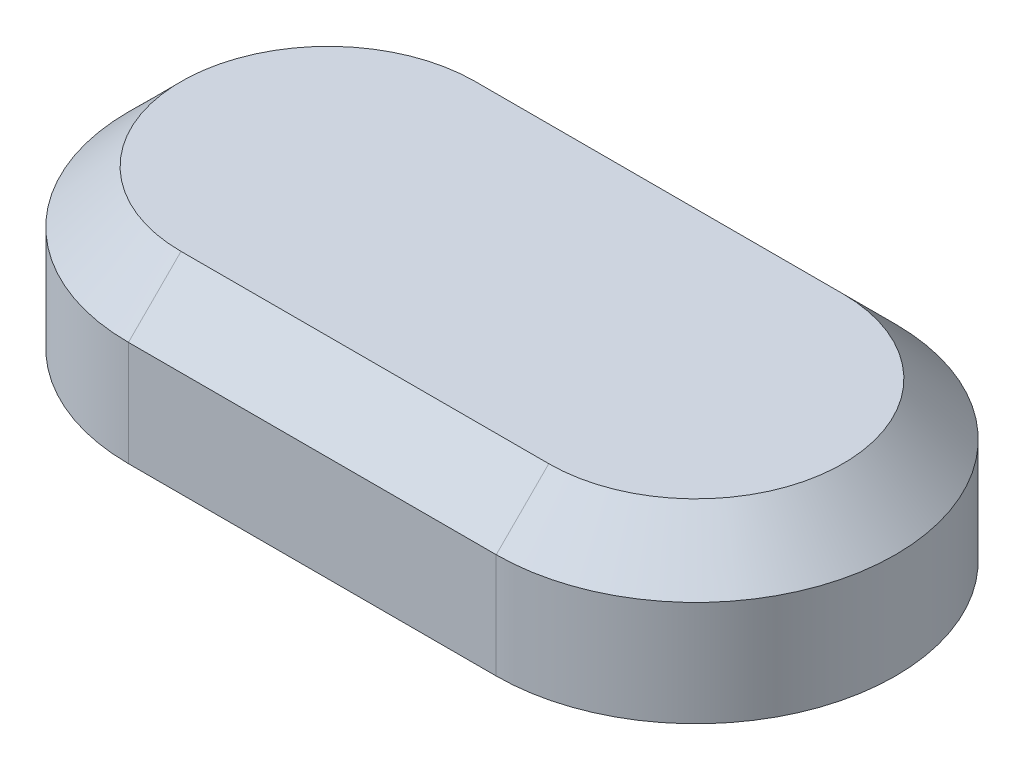
ISO-10303-21;
HEADER;
FILE_DESCRIPTION(('STEP AP214'),'2;1');
FILE_NAME('part.step','',(''),(''),'','','');
FILE_SCHEMA(('AUTOMOTIVE_DESIGN { 1 0 10303 214 1 1 1 1 }'));
ENDSEC;
DATA;
#1=APPLICATION_CONTEXT('core data for automotive mechanical design processes');
#2=APPLICATION_PROTOCOL_DEFINITION('international standard','automotive_design',2000,#1);
#3=PRODUCT_CONTEXT('',#1,'mechanical');
#4=PRODUCT('Part','Part','',(#3));
#5=PRODUCT_RELATED_PRODUCT_CATEGORY('part','',(#4));
#6=PRODUCT_DEFINITION_FORMATION('','',#4);
#7=PRODUCT_DEFINITION_CONTEXT('part definition',#1,'design');
#8=PRODUCT_DEFINITION('design','',#6,#7);
#9=PRODUCT_DEFINITION_SHAPE('','',#8);
#10=(LENGTH_UNIT() NAMED_UNIT(*) SI_UNIT(.MILLI.,.METRE.));
#11=(NAMED_UNIT(*) PLANE_ANGLE_UNIT() SI_UNIT($,.RADIAN.));
#12=(NAMED_UNIT(*) SI_UNIT($,.STERADIAN.) SOLID_ANGLE_UNIT());
#13=UNCERTAINTY_MEASURE_WITH_UNIT(LENGTH_MEASURE(1.E-05),#10,'distance_accuracy_value','');
#14=(GEOMETRIC_REPRESENTATION_CONTEXT(3) GLOBAL_UNCERTAINTY_ASSIGNED_CONTEXT((#13)) GLOBAL_UNIT_ASSIGNED_CONTEXT((#10,
#11,#12)) REPRESENTATION_CONTEXT('',''));
#15=CARTESIAN_POINT('',(0.,0.,0.));
#16=DIRECTION('',(0.,0.,1.));
#17=DIRECTION('',(1.,0.,0.));
#18=AXIS2_PLACEMENT_3D('',#15,#16,#17);
#19=CARTESIAN_POINT('',(-3.5,3.,0.));
#20=DIRECTION('',(0.,-1.,0.));
#21=DIRECTION('',(0.,0.,-1.));
#22=AXIS2_PLACEMENT_3D('',#19,#20,#21);
#23=CYLINDRICAL_SURFACE('',#22,3.8);
#24=DIRECTION('',(0.,-1.,0.));
#25=VECTOR('',#24,1.);
#26=CARTESIAN_POINT('',(-3.5,3.,3.8));
#27=LINE('',#26,#25);
#28=CARTESIAN_POINT('',(-3.5,2.,3.8));
#29=VERTEX_POINT('',#28);
#30=CARTESIAN_POINT('',(-3.5,0.,3.8));
#31=VERTEX_POINT('',#30);
#32=EDGE_CURVE('E101',#29,#31,#27,.T.);
#33=ORIENTED_EDGE('',*,*,#32,.F.);
#34=CARTESIAN_POINT('',(-3.5,2.,0.));
#35=DIRECTION('',(0.,1.,0.));
#36=DIRECTION('',(0.,0.,1.));
#37=AXIS2_PLACEMENT_3D('',#34,#35,#36);
#38=CIRCLE('',#37,3.8);
#39=CARTESIAN_POINT('',(-3.5,2.,-3.8));
#40=VERTEX_POINT('',#39);
#41=EDGE_CURVE('E156',#29,#40,#38,.F.);
#42=ORIENTED_EDGE('',*,*,#41,.T.);
#43=DIRECTION('',(0.,-1.,0.));
#44=VECTOR('',#43,1.);
#45=CARTESIAN_POINT('',(-3.5,3.,-3.8));
#46=LINE('',#45,#44);
#47=CARTESIAN_POINT('',(-3.5,0.,-3.8));
#48=VERTEX_POINT('',#47);
#49=EDGE_CURVE('E124',#40,#48,#46,.T.);
#50=ORIENTED_EDGE('',*,*,#49,.T.);
#51=CARTESIAN_POINT('',(-3.5,0.,0.));
#52=DIRECTION('',(0.,1.,0.));
#53=DIRECTION('',(0.,0.,1.));
#54=AXIS2_PLACEMENT_3D('',#51,#52,#53);
#55=CIRCLE('',#54,3.8);
#56=EDGE_CURVE('E119',#48,#31,#55,.T.);
#57=ORIENTED_EDGE('',*,*,#56,.T.);
#58=EDGE_LOOP('',(#33,#42,#50,#57));
#59=FACE_BOUND('',#58,.T.);
#60=ADVANCED_FACE('F45',(#59),#23,.T.);
#61=CARTESIAN_POINT('',(-3.5,3.,3.8));
#62=DIRECTION('',(0.,0.,-1.));
#63=DIRECTION('',(-1.,0.,0.));
#64=AXIS2_PLACEMENT_3D('',#61,#62,#63);
#65=PLANE('',#64);
#66=DIRECTION('',(0.,-1.,0.));
#67=VECTOR('',#66,1.);
#68=CARTESIAN_POINT('',(3.5,3.,3.8));
#69=LINE('',#68,#67);
#70=CARTESIAN_POINT('',(3.5,2.,3.8));
#71=VERTEX_POINT('',#70);
#72=CARTESIAN_POINT('',(3.5,0.,3.8));
#73=VERTEX_POINT('',#72);
#74=EDGE_CURVE('E113',#71,#73,#69,.T.);
#75=ORIENTED_EDGE('',*,*,#74,.F.);
#76=DIRECTION('',(-1.,0.,0.));
#77=VECTOR('',#76,1.);
#78=CARTESIAN_POINT('',(-3.5,2.,3.8));
#79=LINE('',#78,#77);
#80=EDGE_CURVE('E11',#71,#29,#79,.T.);
#81=ORIENTED_EDGE('',*,*,#80,.T.);
#82=ORIENTED_EDGE('',*,*,#32,.T.);
#83=DIRECTION('',(1.,0.,0.));
#84=VECTOR('',#83,1.);
#85=CARTESIAN_POINT('',(-3.5,0.,3.8));
#86=LINE('',#85,#84);
#87=EDGE_CURVE('E104',#31,#73,#86,.T.);
#88=ORIENTED_EDGE('',*,*,#87,.T.);
#89=EDGE_LOOP('',(#75,#81,#82,#88));
#90=FACE_BOUND('',#89,.T.);
#91=ADVANCED_FACE('F103',(#90),#65,.F.);
#92=CARTESIAN_POINT('',(3.5,3.,0.));
#93=DIRECTION('',(0.,-1.,0.));
#94=DIRECTION('',(0.,0.,-1.));
#95=AXIS2_PLACEMENT_3D('',#92,#93,#94);
#96=CYLINDRICAL_SURFACE('',#95,3.8);
#97=DIRECTION('',(0.,-1.,0.));
#98=VECTOR('',#97,1.);
#99=CARTESIAN_POINT('',(3.5,3.,-3.8));
#100=LINE('',#99,#98);
#101=CARTESIAN_POINT('',(3.5,2.,-3.8));
#102=VERTEX_POINT('',#101);
#103=CARTESIAN_POINT('',(3.5,0.,-3.8));
#104=VERTEX_POINT('',#103);
#105=EDGE_CURVE('E139',#102,#104,#100,.T.);
#106=ORIENTED_EDGE('',*,*,#105,.F.);
#107=CARTESIAN_POINT('',(3.5,2.,0.));
#108=DIRECTION('',(0.,1.,0.));
#109=DIRECTION('',(0.,0.,1.));
#110=AXIS2_PLACEMENT_3D('',#107,#108,#109);
#111=CIRCLE('',#110,3.8);
#112=EDGE_CURVE('E56',#102,#71,#111,.F.);
#113=ORIENTED_EDGE('',*,*,#112,.T.);
#114=ORIENTED_EDGE('',*,*,#74,.T.);
#115=CARTESIAN_POINT('',(3.5,0.,0.));
#116=DIRECTION('',(0.,1.,0.));
#117=DIRECTION('',(0.,0.,1.));
#118=AXIS2_PLACEMENT_3D('',#115,#116,#117);
#119=CIRCLE('',#118,3.8);
#120=EDGE_CURVE('E121',#73,#104,#119,.T.);
#121=ORIENTED_EDGE('',*,*,#120,.T.);
#122=EDGE_LOOP('',(#106,#113,#114,#121));
#123=FACE_BOUND('',#122,.T.);
#124=ADVANCED_FACE('F186',(#123),#96,.T.);
#125=CARTESIAN_POINT('',(-3.5,3.,-3.8));
#126=DIRECTION('',(0.,0.,1.));
#127=DIRECTION('',(1.,0.,0.));
#128=AXIS2_PLACEMENT_3D('',#125,#126,#127);
#129=PLANE('',#128);
#130=ORIENTED_EDGE('',*,*,#49,.F.);
#131=DIRECTION('',(1.,0.,0.));
#132=VECTOR('',#131,1.);
#133=CARTESIAN_POINT('',(3.5,2.,-3.8));
#134=LINE('',#133,#132);
#135=EDGE_CURVE('E71',#40,#102,#134,.T.);
#136=ORIENTED_EDGE('',*,*,#135,.T.);
#137=ORIENTED_EDGE('',*,*,#105,.T.);
#138=DIRECTION('',(-1.,0.,0.));
#139=VECTOR('',#138,1.);
#140=CARTESIAN_POINT('',(-3.5,0.,-3.8));
#141=LINE('',#140,#139);
#142=EDGE_CURVE('E134',#104,#48,#141,.T.);
#143=ORIENTED_EDGE('',*,*,#142,.T.);
#144=EDGE_LOOP('',(#130,#136,#137,#143));
#145=FACE_BOUND('',#144,.T.);
#146=ADVANCED_FACE('F185',(#145),#129,.F.);
#147=CARTESIAN_POINT('',(-3.5,3.,0.));
#148=DIRECTION('',(0.,1.,0.));
#149=DIRECTION('',(0.,0.,1.));
#150=AXIS2_PLACEMENT_3D('',#147,#148,#149);
#151=PLANE('',#150);
#152=DIRECTION('',(-1.,0.,0.));
#153=VECTOR('',#152,1.);
#154=CARTESIAN_POINT('',(-3.5,3.,-2.8));
#155=LINE('',#154,#153);
#156=CARTESIAN_POINT('',(3.5,3.,-2.8));
#157=VERTEX_POINT('',#156);
#158=CARTESIAN_POINT('',(-3.5,3.,-2.8));
#159=VERTEX_POINT('',#158);
#160=EDGE_CURVE('E149',#157,#159,#155,.T.);
#161=ORIENTED_EDGE('',*,*,#160,.T.);
#162=CARTESIAN_POINT('',(-3.5,3.,0.));
#163=DIRECTION('',(0.,1.,0.));
#164=DIRECTION('',(0.,0.,1.));
#165=AXIS2_PLACEMENT_3D('',#162,#163,#164);
#166=CIRCLE('',#165,2.8);
#167=CARTESIAN_POINT('',(-3.5,3.,2.8));
#168=VERTEX_POINT('',#167);
#169=EDGE_CURVE('E152',#159,#168,#166,.T.);
#170=ORIENTED_EDGE('',*,*,#169,.T.);
#171=DIRECTION('',(1.,0.,0.));
#172=VECTOR('',#171,1.);
#173=CARTESIAN_POINT('',(3.5,3.,2.8));
#174=LINE('',#173,#172);
#175=CARTESIAN_POINT('',(3.5,3.,2.8));
#176=VERTEX_POINT('',#175);
#177=EDGE_CURVE('E112',#168,#176,#174,.T.);
#178=ORIENTED_EDGE('',*,*,#177,.T.);
#179=CARTESIAN_POINT('',(3.5,3.,0.));
#180=DIRECTION('',(0.,1.,0.));
#181=DIRECTION('',(0.,0.,1.));
#182=AXIS2_PLACEMENT_3D('',#179,#180,#181);
#183=CIRCLE('',#182,2.8);
#184=EDGE_CURVE('E146',#176,#157,#183,.T.);
#185=ORIENTED_EDGE('',*,*,#184,.T.);
#186=EDGE_LOOP('',(#161,#170,#178,#185));
#187=FACE_BOUND('',#186,.T.);
#188=ADVANCED_FACE('F180',(#187),#151,.T.);
#189=CARTESIAN_POINT('',(-3.5,0.,0.));
#190=DIRECTION('',(0.,1.,0.));
#191=DIRECTION('',(0.,0.,1.));
#192=AXIS2_PLACEMENT_3D('',#189,#190,#191);
#193=PLANE('',#192);
#194=ORIENTED_EDGE('',*,*,#56,.F.);
#195=ORIENTED_EDGE('',*,*,#142,.F.);
#196=ORIENTED_EDGE('',*,*,#120,.F.);
#197=ORIENTED_EDGE('',*,*,#87,.F.);
#198=EDGE_LOOP('',(#194,#195,#196,#197));
#199=FACE_BOUND('',#198,.T.);
#200=ADVANCED_FACE('F117',(#199),#193,.F.);
#201=CARTESIAN_POINT('',(3.5,3.,0.));
#202=DIRECTION('',(0.,-1.,0.));
#203=DIRECTION('',(0.,0.,-1.));
#204=AXIS2_PLACEMENT_3D('',#201,#202,#203);
#205=CONICAL_SURFACE('',#204,2.8,0.785398163397447);
#206=DIRECTION('',(0.,0.707106781186549,-0.707106781186546));
#207=VECTOR('',#206,1.);
#208=CARTESIAN_POINT('',(3.5,2.,3.8));
#209=LINE('',#208,#207);
#210=EDGE_CURVE('E130',#71,#176,#209,.T.);
#211=ORIENTED_EDGE('',*,*,#210,.F.);
#212=ORIENTED_EDGE('',*,*,#112,.F.);
#213=DIRECTION('',(0.,-0.707106781186549,-0.707106781186546));
#214=VECTOR('',#213,1.);
#215=CARTESIAN_POINT('',(3.5,3.,-2.8));
#216=LINE('',#215,#214);
#217=EDGE_CURVE('E50',#157,#102,#216,.T.);
#218=ORIENTED_EDGE('',*,*,#217,.F.);
#219=ORIENTED_EDGE('',*,*,#184,.F.);
#220=EDGE_LOOP('',(#211,#212,#218,#219));
#221=FACE_BOUND('',#220,.T.);
#222=ADVANCED_FACE('F48',(#221),#205,.T.);
#223=CARTESIAN_POINT('',(-3.5,3.,-2.8));
#224=DIRECTION('',(0.,0.707106781186546,-0.707106781186549));
#225=DIRECTION('',(1.,0.,0.));
#226=AXIS2_PLACEMENT_3D('',#223,#224,#225);
#227=PLANE('',#226);
#228=ORIENTED_EDGE('',*,*,#217,.T.);
#229=ORIENTED_EDGE('',*,*,#135,.F.);
#230=DIRECTION('',(0.,-0.707106781186549,-0.707106781186546));
#231=VECTOR('',#230,1.);
#232=CARTESIAN_POINT('',(-3.5,3.,-2.8));
#233=LINE('',#232,#231);
#234=EDGE_CURVE('E166',#159,#40,#233,.T.);
#235=ORIENTED_EDGE('',*,*,#234,.F.);
#236=ORIENTED_EDGE('',*,*,#160,.F.);
#237=EDGE_LOOP('',(#228,#229,#235,#236));
#238=FACE_BOUND('',#237,.T.);
#239=ADVANCED_FACE('F210',(#238),#227,.T.);
#240=CARTESIAN_POINT('',(-3.5,3.,2.8));
#241=DIRECTION('',(0.,0.707106781186546,0.707106781186549));
#242=DIRECTION('',(-1.,0.,0.));
#243=AXIS2_PLACEMENT_3D('',#240,#241,#242);
#244=PLANE('',#243);
#245=ORIENTED_EDGE('',*,*,#210,.T.);
#246=ORIENTED_EDGE('',*,*,#177,.F.);
#247=DIRECTION('',(0.,0.707106781186549,-0.707106781186546));
#248=VECTOR('',#247,1.);
#249=CARTESIAN_POINT('',(-3.5,2.,3.8));
#250=LINE('',#249,#248);
#251=EDGE_CURVE('E163',#29,#168,#250,.T.);
#252=ORIENTED_EDGE('',*,*,#251,.F.);
#253=ORIENTED_EDGE('',*,*,#80,.F.);
#254=EDGE_LOOP('',(#245,#246,#252,#253));
#255=FACE_BOUND('',#254,.T.);
#256=ADVANCED_FACE('F173',(#255),#244,.T.);
#257=CARTESIAN_POINT('',(-3.5,3.,0.));
#258=DIRECTION('',(0.,-1.,0.));
#259=DIRECTION('',(0.,0.,-1.));
#260=AXIS2_PLACEMENT_3D('',#257,#258,#259);
#261=CONICAL_SURFACE('',#260,2.8,0.785398163397447);
#262=ORIENTED_EDGE('',*,*,#234,.T.);
#263=ORIENTED_EDGE('',*,*,#41,.F.);
#264=ORIENTED_EDGE('',*,*,#251,.T.);
#265=ORIENTED_EDGE('',*,*,#169,.F.);
#266=EDGE_LOOP('',(#262,#263,#264,#265));
#267=FACE_BOUND('',#266,.T.);
#268=ADVANCED_FACE('F184',(#267),#261,.T.);
#269=CLOSED_SHELL('',(#60,#91,#124,#146,#188,#200,#222,#239,#256,#268));
#270=MANIFOLD_SOLID_BREP('B2',#269);
#271=ADVANCED_BREP_SHAPE_REPRESENTATION('',(#18,#270),#14);
#272=SHAPE_DEFINITION_REPRESENTATION(#9,#271);
ENDSEC;
END-ISO-10303-21;
